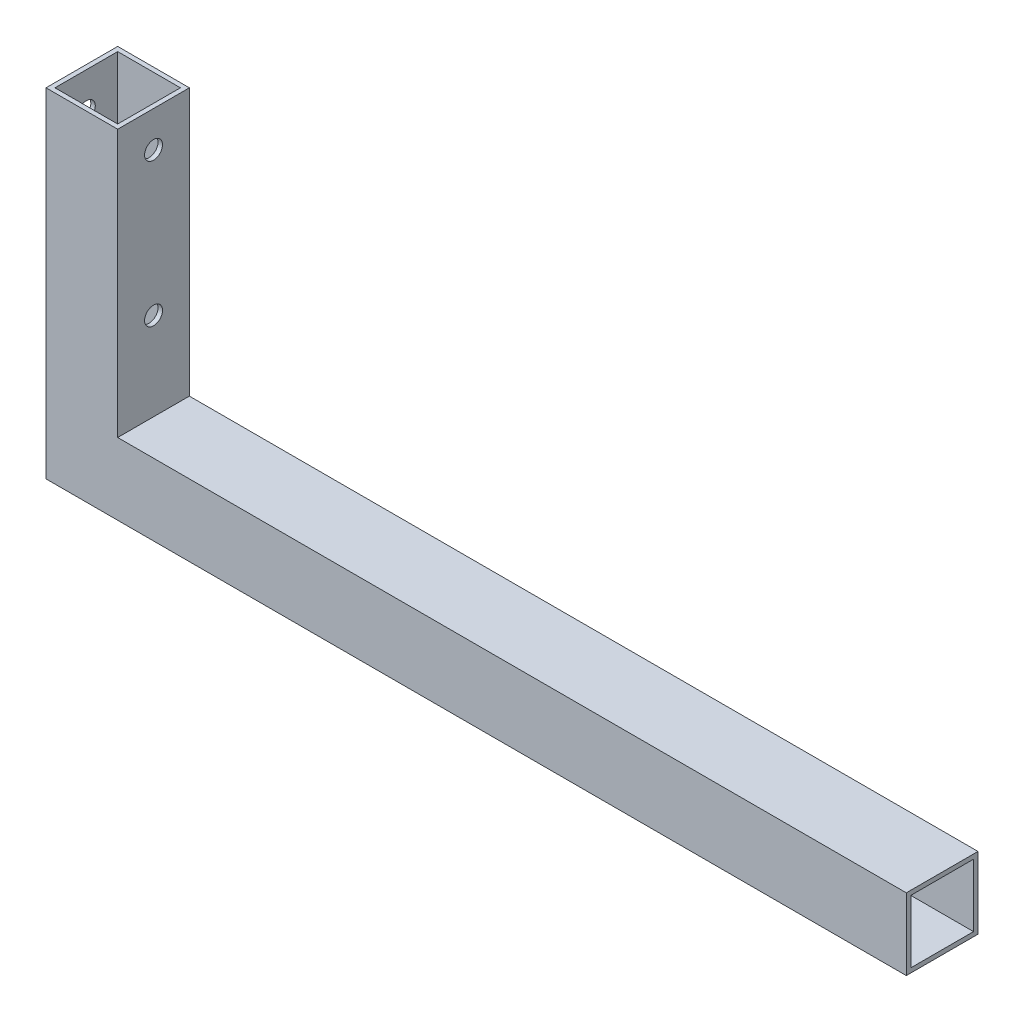
ISO-10303-21;
HEADER;
FILE_DESCRIPTION(('STEP AP214'),'2;1');
FILE_NAME('part.step','',(''),(''),'','','');
FILE_SCHEMA(('AUTOMOTIVE_DESIGN { 1 0 10303 214 1 1 1 1 }'));
ENDSEC;
DATA;
#1=APPLICATION_CONTEXT('core data for automotive mechanical design processes');
#2=APPLICATION_PROTOCOL_DEFINITION('international standard','automotive_design',2000,#1);
#3=PRODUCT_CONTEXT('',#1,'mechanical');
#4=PRODUCT('Part','Part','',(#3));
#5=PRODUCT_RELATED_PRODUCT_CATEGORY('part','',(#4));
#6=PRODUCT_DEFINITION_FORMATION('','',#4);
#7=PRODUCT_DEFINITION_CONTEXT('part definition',#1,'design');
#8=PRODUCT_DEFINITION('design','',#6,#7);
#9=PRODUCT_DEFINITION_SHAPE('','',#8);
#10=(LENGTH_UNIT() NAMED_UNIT(*) SI_UNIT(.MILLI.,.METRE.));
#11=(NAMED_UNIT(*) PLANE_ANGLE_UNIT() SI_UNIT($,.RADIAN.));
#12=(NAMED_UNIT(*) SI_UNIT($,.STERADIAN.) SOLID_ANGLE_UNIT());
#13=UNCERTAINTY_MEASURE_WITH_UNIT(LENGTH_MEASURE(1.E-05),#10,'distance_accuracy_value','');
#14=(GEOMETRIC_REPRESENTATION_CONTEXT(3) GLOBAL_UNCERTAINTY_ASSIGNED_CONTEXT((#13)) GLOBAL_UNIT_ASSIGNED_CONTEXT((#10,
#11,#12)) REPRESENTATION_CONTEXT('',''));
#15=CARTESIAN_POINT('',(0.,0.,0.));
#16=DIRECTION('',(0.,0.,1.));
#17=DIRECTION('',(1.,0.,0.));
#18=AXIS2_PLACEMENT_3D('',#15,#16,#17);
#19=CARTESIAN_POINT('',(0.,228.6,0.));
#20=DIRECTION('',(0.,1.,0.));
#21=DIRECTION('',(0.,0.,1.));
#22=AXIS2_PLACEMENT_3D('',#19,#20,#21);
#23=PLANE('',#22);
#24=DIRECTION('',(0.,0.,-1.));
#25=VECTOR('',#24,1.);
#26=CARTESIAN_POINT('',(12.7,228.6,-12.7));
#27=LINE('',#26,#25);
#28=CARTESIAN_POINT('',(12.7,228.6,12.7));
#29=VERTEX_POINT('',#28);
#30=CARTESIAN_POINT('',(12.7,228.6,-12.7));
#31=VERTEX_POINT('',#30);
#32=EDGE_CURVE('E218',#29,#31,#27,.T.);
#33=ORIENTED_EDGE('',*,*,#32,.T.);
#34=DIRECTION('',(-1.,0.,0.));
#35=VECTOR('',#34,1.);
#36=CARTESIAN_POINT('',(-12.7,228.6,-12.7));
#37=LINE('',#36,#35);
#38=CARTESIAN_POINT('',(-12.7,228.6,-12.7));
#39=VERTEX_POINT('',#38);
#40=EDGE_CURVE('E221',#31,#39,#37,.T.);
#41=ORIENTED_EDGE('',*,*,#40,.T.);
#42=DIRECTION('',(0.,0.,1.));
#43=VECTOR('',#42,1.);
#44=CARTESIAN_POINT('',(-12.7,228.6,-12.7));
#45=LINE('',#44,#43);
#46=CARTESIAN_POINT('',(-12.7,228.6,12.7));
#47=VERTEX_POINT('',#46);
#48=EDGE_CURVE('E223',#39,#47,#45,.T.);
#49=ORIENTED_EDGE('',*,*,#48,.T.);
#50=DIRECTION('',(1.,0.,0.));
#51=VECTOR('',#50,1.);
#52=CARTESIAN_POINT('',(-12.7,228.6,12.7));
#53=LINE('',#52,#51);
#54=EDGE_CURVE('E225',#47,#29,#53,.T.);
#55=ORIENTED_EDGE('',*,*,#54,.T.);
#56=EDGE_LOOP('',(#33,#41,#49,#55));
#57=FACE_BOUND('',#56,.T.);
#58=DIRECTION('',(1.,0.,0.));
#59=VECTOR('',#58,1.);
#60=CARTESIAN_POINT('',(11.1125,228.6,11.1125));
#61=LINE('',#60,#59);
#62=CARTESIAN_POINT('',(-11.1125,228.6,11.1125));
#63=VERTEX_POINT('',#62);
#64=CARTESIAN_POINT('',(11.1125,228.6,11.1125));
#65=VERTEX_POINT('',#64);
#66=EDGE_CURVE('E204',#63,#65,#61,.T.);
#67=ORIENTED_EDGE('',*,*,#66,.F.);
#68=DIRECTION('',(0.,0.,1.));
#69=VECTOR('',#68,1.);
#70=CARTESIAN_POINT('',(-11.1125,228.6,11.1125));
#71=LINE('',#70,#69);
#72=CARTESIAN_POINT('',(-11.1125,228.6,-11.1125));
#73=VERTEX_POINT('',#72);
#74=EDGE_CURVE('E202',#73,#63,#71,.T.);
#75=ORIENTED_EDGE('',*,*,#74,.F.);
#76=DIRECTION('',(-1.,0.,0.));
#77=VECTOR('',#76,1.);
#78=CARTESIAN_POINT('',(11.1125,228.6,-11.1125));
#79=LINE('',#78,#77);
#80=CARTESIAN_POINT('',(11.1125,228.6,-11.1125));
#81=VERTEX_POINT('',#80);
#82=EDGE_CURVE('E208',#81,#73,#79,.T.);
#83=ORIENTED_EDGE('',*,*,#82,.F.);
#84=DIRECTION('',(0.,0.,-1.));
#85=VECTOR('',#84,1.);
#86=CARTESIAN_POINT('',(11.1125,228.6,11.1125));
#87=LINE('',#86,#85);
#88=EDGE_CURVE('E206',#65,#81,#87,.T.);
#89=ORIENTED_EDGE('',*,*,#88,.F.);
#90=EDGE_LOOP('',(#67,#75,#83,#89));
#91=FACE_BOUND('',#90,.T.);
#92=ADVANCED_FACE('F34',(#57,#91),#23,.T.);
#93=CARTESIAN_POINT('',(12.7,228.6,-12.7));
#94=DIRECTION('',(-1.,0.,0.));
#95=DIRECTION('',(0.,0.,1.));
#96=AXIS2_PLACEMENT_3D('',#93,#94,#95);
#97=PLANE('',#96);
#98=CARTESIAN_POINT('',(12.7,165.1,0.));
#99=DIRECTION('',(1.,0.,0.));
#100=DIRECTION('',(0.,0.,-1.));
#101=AXIS2_PLACEMENT_3D('',#98,#99,#100);
#102=CIRCLE('',#101,3.175);
#103=CARTESIAN_POINT('',(12.7,165.1,-3.175));
#104=VERTEX_POINT('',#103);
#105=EDGE_CURVE('E183',#104,#104,#102,.T.);
#106=ORIENTED_EDGE('',*,*,#105,.F.);
#107=EDGE_LOOP('',(#106));
#108=FACE_BOUND('',#107,.T.);
#109=CARTESIAN_POINT('',(12.7,215.9,0.));
#110=DIRECTION('',(1.,0.,0.));
#111=DIRECTION('',(0.,0.,-1.));
#112=AXIS2_PLACEMENT_3D('',#109,#110,#111);
#113=CIRCLE('',#112,3.175);
#114=CARTESIAN_POINT('',(12.7,215.9,-3.17499999999999));
#115=VERTEX_POINT('',#114);
#116=EDGE_CURVE('E192',#115,#115,#113,.T.);
#117=ORIENTED_EDGE('',*,*,#116,.F.);
#118=EDGE_LOOP('',(#117));
#119=FACE_BOUND('',#118,.T.);
#120=DIRECTION('',(0.,-1.,0.));
#121=VECTOR('',#120,1.);
#122=CARTESIAN_POINT('',(12.7,228.6,12.7));
#123=LINE('',#122,#121);
#124=CARTESIAN_POINT('',(12.7,134.,12.7));
#125=VERTEX_POINT('',#124);
#126=EDGE_CURVE('E227',#29,#125,#123,.T.);
#127=ORIENTED_EDGE('',*,*,#126,.T.);
#128=DIRECTION('',(0.,0.,1.));
#129=VECTOR('',#128,1.);
#130=CARTESIAN_POINT('',(12.7,134.,-12.7));
#131=LINE('',#130,#129);
#132=CARTESIAN_POINT('',(12.7,134.,-12.7));
#133=VERTEX_POINT('',#132);
#134=EDGE_CURVE('E174',#133,#125,#131,.T.);
#135=ORIENTED_EDGE('',*,*,#134,.F.);
#136=DIRECTION('',(0.,-1.,0.));
#137=VECTOR('',#136,1.);
#138=CARTESIAN_POINT('',(12.7,228.6,-12.7));
#139=LINE('',#138,#137);
#140=EDGE_CURVE('E11',#31,#133,#139,.T.);
#141=ORIENTED_EDGE('',*,*,#140,.F.);
#142=ORIENTED_EDGE('',*,*,#32,.F.);
#143=EDGE_LOOP('',(#127,#135,#141,#142));
#144=FACE_BOUND('',#143,.T.);
#145=ADVANCED_FACE('F36',(#108,#119,#144),#97,.F.);
#146=CARTESIAN_POINT('',(-12.7,228.6,-12.7));
#147=DIRECTION('',(0.,0.,1.));
#148=DIRECTION('',(1.,0.,0.));
#149=AXIS2_PLACEMENT_3D('',#146,#147,#148);
#150=PLANE('',#149);
#151=ORIENTED_EDGE('',*,*,#140,.T.);
#152=DIRECTION('',(-1.,0.,0.));
#153=VECTOR('',#152,1.);
#154=CARTESIAN_POINT('',(292.1,134.,-12.7));
#155=LINE('',#154,#153);
#156=CARTESIAN_POINT('',(292.1,134.,-12.7));
#157=VERTEX_POINT('',#156);
#158=EDGE_CURVE('E161',#157,#133,#155,.T.);
#159=ORIENTED_EDGE('',*,*,#158,.F.);
#160=DIRECTION('',(0.,1.,0.));
#161=VECTOR('',#160,1.);
#162=CARTESIAN_POINT('',(292.1,108.6,-12.7));
#163=LINE('',#162,#161);
#164=CARTESIAN_POINT('',(292.1,108.6,-12.7));
#165=VERTEX_POINT('',#164);
#166=EDGE_CURVE('E159',#165,#157,#163,.T.);
#167=ORIENTED_EDGE('',*,*,#166,.F.);
#168=DIRECTION('',(1.,0.,0.));
#169=VECTOR('',#168,1.);
#170=CARTESIAN_POINT('',(-500000.,108.6,-12.7));
#171=LINE('',#170,#169);
#172=CARTESIAN_POINT('',(-12.7,108.6,-12.7));
#173=VERTEX_POINT('',#172);
#174=EDGE_CURVE('E169',#173,#165,#171,.T.);
#175=ORIENTED_EDGE('',*,*,#174,.F.);
#176=DIRECTION('',(0.,-1.,0.));
#177=VECTOR('',#176,1.);
#178=CARTESIAN_POINT('',(-12.7,228.6,-12.7));
#179=LINE('',#178,#177);
#180=EDGE_CURVE('E43',#39,#173,#179,.T.);
#181=ORIENTED_EDGE('',*,*,#180,.F.);
#182=ORIENTED_EDGE('',*,*,#40,.F.);
#183=EDGE_LOOP('',(#151,#159,#167,#175,#181,#182));
#184=FACE_BOUND('',#183,.T.);
#185=ADVANCED_FACE('F257',(#184),#150,.F.);
#186=CARTESIAN_POINT('',(-12.7,228.6,-12.7));
#187=DIRECTION('',(1.,0.,0.));
#188=DIRECTION('',(0.,0.,-1.));
#189=AXIS2_PLACEMENT_3D('',#186,#187,#188);
#190=PLANE('',#189);
#191=CARTESIAN_POINT('',(-12.7,165.1,0.));
#192=DIRECTION('',(1.,0.,0.));
#193=DIRECTION('',(0.,0.,-1.));
#194=AXIS2_PLACEMENT_3D('',#191,#192,#193);
#195=CIRCLE('',#194,3.175);
#196=CARTESIAN_POINT('',(-12.7,165.1,-3.175));
#197=VERTEX_POINT('',#196);
#198=EDGE_CURVE('E184',#197,#197,#195,.T.);
#199=ORIENTED_EDGE('',*,*,#198,.T.);
#200=EDGE_LOOP('',(#199));
#201=FACE_BOUND('',#200,.T.);
#202=CARTESIAN_POINT('',(-12.7,215.9,0.));
#203=DIRECTION('',(1.,0.,0.));
#204=DIRECTION('',(0.,0.,-1.));
#205=AXIS2_PLACEMENT_3D('',#202,#203,#204);
#206=CIRCLE('',#205,3.175);
#207=CARTESIAN_POINT('',(-12.7,215.9,-3.17499999999999));
#208=VERTEX_POINT('',#207);
#209=EDGE_CURVE('E193',#208,#208,#206,.T.);
#210=ORIENTED_EDGE('',*,*,#209,.T.);
#211=EDGE_LOOP('',(#210));
#212=FACE_BOUND('',#211,.T.);
#213=ORIENTED_EDGE('',*,*,#180,.T.);
#214=DIRECTION('',(0.,0.,1.));
#215=VECTOR('',#214,1.);
#216=CARTESIAN_POINT('',(-12.7,108.6,-12.7));
#217=LINE('',#216,#215);
#218=CARTESIAN_POINT('',(-12.7,108.6,12.7));
#219=VERTEX_POINT('',#218);
#220=EDGE_CURVE('E175',#173,#219,#217,.T.);
#221=ORIENTED_EDGE('',*,*,#220,.T.);
#222=DIRECTION('',(0.,-1.,0.));
#223=VECTOR('',#222,1.);
#224=CARTESIAN_POINT('',(-12.7,228.6,12.7));
#225=LINE('',#224,#223);
#226=EDGE_CURVE('E229',#47,#219,#225,.T.);
#227=ORIENTED_EDGE('',*,*,#226,.F.);
#228=ORIENTED_EDGE('',*,*,#48,.F.);
#229=EDGE_LOOP('',(#213,#221,#227,#228));
#230=FACE_BOUND('',#229,.T.);
#231=ADVANCED_FACE('F265',(#201,#212,#230),#190,.F.);
#232=CARTESIAN_POINT('',(-12.7,228.6,12.7));
#233=DIRECTION('',(0.,0.,-1.));
#234=DIRECTION('',(-1.,0.,0.));
#235=AXIS2_PLACEMENT_3D('',#232,#233,#234);
#236=PLANE('',#235);
#237=ORIENTED_EDGE('',*,*,#226,.T.);
#238=DIRECTION('',(1.,0.,0.));
#239=VECTOR('',#238,1.);
#240=CARTESIAN_POINT('',(-500000.,108.6,12.7));
#241=LINE('',#240,#239);
#242=CARTESIAN_POINT('',(292.1,108.6,12.7));
#243=VERTEX_POINT('',#242);
#244=EDGE_CURVE('E172',#219,#243,#241,.T.);
#245=ORIENTED_EDGE('',*,*,#244,.T.);
#246=DIRECTION('',(0.,-1.,0.));
#247=VECTOR('',#246,1.);
#248=CARTESIAN_POINT('',(292.1,134.,12.7));
#249=LINE('',#248,#247);
#250=CARTESIAN_POINT('',(292.1,134.,12.7));
#251=VERTEX_POINT('',#250);
#252=EDGE_CURVE('E153',#251,#243,#249,.T.);
#253=ORIENTED_EDGE('',*,*,#252,.F.);
#254=DIRECTION('',(-1.,0.,0.));
#255=VECTOR('',#254,1.);
#256=CARTESIAN_POINT('',(292.1,134.,12.7));
#257=LINE('',#256,#255);
#258=EDGE_CURVE('E131',#251,#125,#257,.T.);
#259=ORIENTED_EDGE('',*,*,#258,.T.);
#260=ORIENTED_EDGE('',*,*,#126,.F.);
#261=ORIENTED_EDGE('',*,*,#54,.F.);
#262=EDGE_LOOP('',(#237,#245,#253,#259,#260,#261));
#263=FACE_BOUND('',#262,.T.);
#264=ADVANCED_FACE('F262',(#263),#236,.F.);
#265=CARTESIAN_POINT('',(-11.1125,228.6,11.1125));
#266=DIRECTION('',(1.,0.,0.));
#267=DIRECTION('',(0.,0.,-1.));
#268=AXIS2_PLACEMENT_3D('',#265,#266,#267);
#269=PLANE('',#268);
#270=DIRECTION('',(0.,0.,1.));
#271=VECTOR('',#270,1.);
#272=CARTESIAN_POINT('',(-11.1125,110.1875,11.1125));
#273=LINE('',#272,#271);
#274=CARTESIAN_POINT('',(-11.1124999999674,110.1875,-11.1125));
#275=VERTEX_POINT('',#274);
#276=CARTESIAN_POINT('',(-11.1125,110.1875,11.1125));
#277=VERTEX_POINT('',#276);
#278=EDGE_CURVE('E180',#275,#277,#273,.T.);
#279=ORIENTED_EDGE('',*,*,#278,.F.);
#280=DIRECTION('',(0.,-1.,0.));
#281=VECTOR('',#280,1.);
#282=CARTESIAN_POINT('',(-11.1125,228.6,-11.1125));
#283=LINE('',#282,#281);
#284=EDGE_CURVE('E210',#73,#275,#283,.T.);
#285=ORIENTED_EDGE('',*,*,#284,.F.);
#286=ORIENTED_EDGE('',*,*,#74,.T.);
#287=DIRECTION('',(0.,-1.,0.));
#288=VECTOR('',#287,1.);
#289=CARTESIAN_POINT('',(-11.1125,228.6,11.1125));
#290=LINE('',#289,#288);
#291=EDGE_CURVE('E216',#63,#277,#290,.T.);
#292=ORIENTED_EDGE('',*,*,#291,.T.);
#293=EDGE_LOOP('',(#279,#285,#286,#292));
#294=FACE_BOUND('',#293,.T.);
#295=CARTESIAN_POINT('',(-11.1125,165.1,0.));
#296=DIRECTION('',(1.,0.,0.));
#297=DIRECTION('',(0.,0.,-1.));
#298=AXIS2_PLACEMENT_3D('',#295,#296,#297);
#299=CIRCLE('',#298,3.175);
#300=CARTESIAN_POINT('',(-11.1125,165.1,-3.175));
#301=VERTEX_POINT('',#300);
#302=EDGE_CURVE('E189',#301,#301,#299,.T.);
#303=ORIENTED_EDGE('',*,*,#302,.F.);
#304=EDGE_LOOP('',(#303));
#305=FACE_BOUND('',#304,.T.);
#306=CARTESIAN_POINT('',(-11.1125,215.9,0.));
#307=DIRECTION('',(1.,0.,0.));
#308=DIRECTION('',(0.,0.,-1.));
#309=AXIS2_PLACEMENT_3D('',#306,#307,#308);
#310=CIRCLE('',#309,3.175);
#311=CARTESIAN_POINT('',(-11.1125,215.9,-3.17499999999999));
#312=VERTEX_POINT('',#311);
#313=EDGE_CURVE('E199',#312,#312,#310,.T.);
#314=ORIENTED_EDGE('',*,*,#313,.F.);
#315=EDGE_LOOP('',(#314));
#316=FACE_BOUND('',#315,.T.);
#317=ADVANCED_FACE('F247',(#294,#305,#316),#269,.T.);
#318=CARTESIAN_POINT('',(11.1125,228.6,11.1125));
#319=DIRECTION('',(0.,0.,-1.));
#320=DIRECTION('',(-1.,0.,0.));
#321=AXIS2_PLACEMENT_3D('',#318,#319,#320);
#322=PLANE('',#321);
#323=DIRECTION('',(0.,-1.,0.));
#324=VECTOR('',#323,1.);
#325=CARTESIAN_POINT('',(11.1125,228.6,11.1125));
#326=LINE('',#325,#324);
#327=CARTESIAN_POINT('',(11.1125,132.4125,11.1125));
#328=VERTEX_POINT('',#327);
#329=EDGE_CURVE('E213',#65,#328,#326,.T.);
#330=ORIENTED_EDGE('',*,*,#329,.T.);
#331=DIRECTION('',(1.,0.,0.));
#332=VECTOR('',#331,1.);
#333=CARTESIAN_POINT('',(-500000.,132.4125,11.1125));
#334=LINE('',#333,#332);
#335=CARTESIAN_POINT('',(292.1,132.4125,11.1125));
#336=VERTEX_POINT('',#335);
#337=EDGE_CURVE('E130',#328,#336,#334,.T.);
#338=ORIENTED_EDGE('',*,*,#337,.T.);
#339=DIRECTION('',(0.,-1.,0.));
#340=VECTOR('',#339,1.);
#341=CARTESIAN_POINT('',(292.1,132.4125,11.1125));
#342=LINE('',#341,#340);
#343=CARTESIAN_POINT('',(292.1,110.1875,11.1125));
#344=VERTEX_POINT('',#343);
#345=EDGE_CURVE('E144',#336,#344,#342,.T.);
#346=ORIENTED_EDGE('',*,*,#345,.T.);
#347=DIRECTION('',(1.,0.,0.));
#348=VECTOR('',#347,1.);
#349=CARTESIAN_POINT('',(-500000.,110.1875,11.1125));
#350=LINE('',#349,#348);
#351=EDGE_CURVE('E167',#277,#344,#350,.T.);
#352=ORIENTED_EDGE('',*,*,#351,.F.);
#353=ORIENTED_EDGE('',*,*,#291,.F.);
#354=ORIENTED_EDGE('',*,*,#66,.T.);
#355=EDGE_LOOP('',(#330,#338,#346,#352,#353,#354));
#356=FACE_BOUND('',#355,.T.);
#357=ADVANCED_FACE('F240',(#356),#322,.T.);
#358=CARTESIAN_POINT('',(11.1125,228.6,11.1125));
#359=DIRECTION('',(-1.,0.,0.));
#360=DIRECTION('',(0.,0.,1.));
#361=AXIS2_PLACEMENT_3D('',#358,#359,#360);
#362=PLANE('',#361);
#363=DIRECTION('',(0.,0.,-1.));
#364=VECTOR('',#363,1.);
#365=CARTESIAN_POINT('',(11.1125,132.4125,11.1125));
#366=LINE('',#365,#364);
#367=CARTESIAN_POINT('',(11.1125,132.4125,-11.1125));
#368=VERTEX_POINT('',#367);
#369=EDGE_CURVE('E129',#328,#368,#366,.T.);
#370=ORIENTED_EDGE('',*,*,#369,.F.);
#371=ORIENTED_EDGE('',*,*,#329,.F.);
#372=ORIENTED_EDGE('',*,*,#88,.T.);
#373=DIRECTION('',(0.,-1.,0.));
#374=VECTOR('',#373,1.);
#375=CARTESIAN_POINT('',(11.1125,228.6,-11.1125));
#376=LINE('',#375,#374);
#377=EDGE_CURVE('E51',#81,#368,#376,.T.);
#378=ORIENTED_EDGE('',*,*,#377,.T.);
#379=EDGE_LOOP('',(#370,#371,#372,#378));
#380=FACE_BOUND('',#379,.T.);
#381=CARTESIAN_POINT('',(11.1125,165.1,0.));
#382=DIRECTION('',(-1.,0.,0.));
#383=DIRECTION('',(0.,0.,1.));
#384=AXIS2_PLACEMENT_3D('',#381,#382,#383);
#385=CIRCLE('',#384,3.175);
#386=CARTESIAN_POINT('',(11.1125,165.1,3.17499999999999));
#387=VERTEX_POINT('',#386);
#388=EDGE_CURVE('E38',#387,#387,#385,.T.);
#389=ORIENTED_EDGE('',*,*,#388,.F.);
#390=EDGE_LOOP('',(#389));
#391=FACE_BOUND('',#390,.T.);
#392=CARTESIAN_POINT('',(11.1125,215.9,0.));
#393=DIRECTION('',(-1.,0.,0.));
#394=DIRECTION('',(0.,0.,1.));
#395=AXIS2_PLACEMENT_3D('',#392,#393,#394);
#396=CIRCLE('',#395,3.175);
#397=CARTESIAN_POINT('',(11.1125,215.9,3.175));
#398=VERTEX_POINT('',#397);
#399=EDGE_CURVE('E196',#398,#398,#396,.T.);
#400=ORIENTED_EDGE('',*,*,#399,.F.);
#401=EDGE_LOOP('',(#400));
#402=FACE_BOUND('',#401,.T.);
#403=ADVANCED_FACE('F238',(#380,#391,#402),#362,.T.);
#404=CARTESIAN_POINT('',(11.1125,228.6,-11.1125));
#405=DIRECTION('',(0.,0.,1.));
#406=DIRECTION('',(1.,0.,0.));
#407=AXIS2_PLACEMENT_3D('',#404,#405,#406);
#408=PLANE('',#407);
#409=ORIENTED_EDGE('',*,*,#284,.T.);
#410=DIRECTION('',(1.,0.,0.));
#411=VECTOR('',#410,1.);
#412=CARTESIAN_POINT('',(-500000.,110.1875,-11.1125));
#413=LINE('',#412,#411);
#414=CARTESIAN_POINT('',(292.1,110.1875,-11.1125));
#415=VERTEX_POINT('',#414);
#416=EDGE_CURVE('E137',#275,#415,#413,.T.);
#417=ORIENTED_EDGE('',*,*,#416,.T.);
#418=DIRECTION('',(0.,1.,0.));
#419=VECTOR('',#418,1.);
#420=CARTESIAN_POINT('',(292.1,110.1875,-11.1125));
#421=LINE('',#420,#419);
#422=CARTESIAN_POINT('',(292.1,132.4125,-11.1125));
#423=VERTEX_POINT('',#422);
#424=EDGE_CURVE('E134',#415,#423,#421,.T.);
#425=ORIENTED_EDGE('',*,*,#424,.T.);
#426=DIRECTION('',(1.,0.,0.));
#427=VECTOR('',#426,1.);
#428=CARTESIAN_POINT('',(-500000.,132.4125,-11.1125));
#429=LINE('',#428,#427);
#430=EDGE_CURVE('E122',#368,#423,#429,.T.);
#431=ORIENTED_EDGE('',*,*,#430,.F.);
#432=ORIENTED_EDGE('',*,*,#377,.F.);
#433=ORIENTED_EDGE('',*,*,#82,.T.);
#434=EDGE_LOOP('',(#409,#417,#425,#431,#432,#433));
#435=FACE_BOUND('',#434,.T.);
#436=ADVANCED_FACE('F135',(#435),#408,.T.);
#437=CARTESIAN_POINT('',(-12.7,215.9,0.));
#438=DIRECTION('',(1.,0.,0.));
#439=DIRECTION('',(0.,0.,-1.));
#440=AXIS2_PLACEMENT_3D('',#437,#438,#439);
#441=CYLINDRICAL_SURFACE('',#440,3.175);
#442=ORIENTED_EDGE('',*,*,#399,.T.);
#443=EDGE_LOOP('',(#442));
#444=FACE_BOUND('',#443,.T.);
#445=ORIENTED_EDGE('',*,*,#116,.T.);
#446=EDGE_LOOP('',(#445));
#447=FACE_BOUND('',#446,.T.);
#448=ADVANCED_FACE('F235',(#444,#447),#441,.F.);
#449=ORIENTED_EDGE('',*,*,#313,.T.);
#450=EDGE_LOOP('',(#449));
#451=FACE_BOUND('',#450,.T.);
#452=ORIENTED_EDGE('',*,*,#209,.F.);
#453=EDGE_LOOP('',(#452));
#454=FACE_BOUND('',#453,.T.);
#455=ADVANCED_FACE('F334',(#451,#454),#441,.F.);
#456=CARTESIAN_POINT('',(-12.7,165.1,0.));
#457=DIRECTION('',(1.,0.,0.));
#458=DIRECTION('',(0.,0.,-1.));
#459=AXIS2_PLACEMENT_3D('',#456,#457,#458);
#460=CYLINDRICAL_SURFACE('',#459,3.175);
#461=ORIENTED_EDGE('',*,*,#388,.T.);
#462=EDGE_LOOP('',(#461));
#463=FACE_BOUND('',#462,.T.);
#464=ORIENTED_EDGE('',*,*,#105,.T.);
#465=EDGE_LOOP('',(#464));
#466=FACE_BOUND('',#465,.T.);
#467=ADVANCED_FACE('F304',(#463,#466),#460,.F.);
#468=ORIENTED_EDGE('',*,*,#302,.T.);
#469=EDGE_LOOP('',(#468));
#470=FACE_BOUND('',#469,.T.);
#471=ORIENTED_EDGE('',*,*,#198,.F.);
#472=EDGE_LOOP('',(#471));
#473=FACE_BOUND('',#472,.T.);
#474=ADVANCED_FACE('F296',(#470,#473),#460,.F.);
#475=CARTESIAN_POINT('',(-500000.,108.6,12.7));
#476=DIRECTION('',(0.,-1.,0.));
#477=DIRECTION('',(0.,0.,-1.));
#478=AXIS2_PLACEMENT_3D('',#475,#476,#477);
#479=PLANE('',#478);
#480=ORIENTED_EDGE('',*,*,#244,.F.);
#481=ORIENTED_EDGE('',*,*,#220,.F.);
#482=ORIENTED_EDGE('',*,*,#174,.T.);
#483=DIRECTION('',(0.,0.,-1.));
#484=VECTOR('',#483,1.);
#485=CARTESIAN_POINT('',(292.1,108.6,12.7));
#486=LINE('',#485,#484);
#487=EDGE_CURVE('E156',#243,#165,#486,.T.);
#488=ORIENTED_EDGE('',*,*,#487,.F.);
#489=EDGE_LOOP('',(#480,#481,#482,#488));
#490=FACE_BOUND('',#489,.T.);
#491=ADVANCED_FACE('F290',(#490),#479,.T.);
#492=CARTESIAN_POINT('',(-500000.,132.4125,-11.1125));
#493=DIRECTION('',(0.,1.,0.));
#494=DIRECTION('',(0.,0.,1.));
#495=AXIS2_PLACEMENT_3D('',#492,#493,#494);
#496=PLANE('',#495);
#497=ORIENTED_EDGE('',*,*,#369,.T.);
#498=ORIENTED_EDGE('',*,*,#430,.T.);
#499=DIRECTION('',(0.,0.,1.));
#500=VECTOR('',#499,1.);
#501=CARTESIAN_POINT('',(292.1,132.4125,-11.1125));
#502=LINE('',#501,#500);
#503=EDGE_CURVE('E127',#423,#336,#502,.T.);
#504=ORIENTED_EDGE('',*,*,#503,.T.);
#505=ORIENTED_EDGE('',*,*,#337,.F.);
#506=EDGE_LOOP('',(#497,#498,#504,#505));
#507=FACE_BOUND('',#506,.T.);
#508=ADVANCED_FACE('F124',(#507),#496,.F.);
#509=CARTESIAN_POINT('',(-500000.,110.1875,11.1125));
#510=DIRECTION('',(0.,-1.,0.));
#511=DIRECTION('',(0.,0.,-1.));
#512=AXIS2_PLACEMENT_3D('',#509,#510,#511);
#513=PLANE('',#512);
#514=ORIENTED_EDGE('',*,*,#278,.T.);
#515=ORIENTED_EDGE('',*,*,#351,.T.);
#516=DIRECTION('',(0.,0.,-1.));
#517=VECTOR('',#516,1.);
#518=CARTESIAN_POINT('',(292.1,110.1875,11.1125));
#519=LINE('',#518,#517);
#520=EDGE_CURVE('E146',#344,#415,#519,.T.);
#521=ORIENTED_EDGE('',*,*,#520,.T.);
#522=ORIENTED_EDGE('',*,*,#416,.F.);
#523=EDGE_LOOP('',(#514,#515,#521,#522));
#524=FACE_BOUND('',#523,.T.);
#525=ADVANCED_FACE('F302',(#524),#513,.F.);
#526=CARTESIAN_POINT('',(292.1,0.,0.));
#527=DIRECTION('',(1.,0.,0.));
#528=DIRECTION('',(0.,0.,-1.));
#529=AXIS2_PLACEMENT_3D('',#526,#527,#528);
#530=PLANE('',#529);
#531=DIRECTION('',(0.,0.,1.));
#532=VECTOR('',#531,1.);
#533=CARTESIAN_POINT('',(292.1,134.,-12.7));
#534=LINE('',#533,#532);
#535=EDGE_CURVE('E150',#157,#251,#534,.T.);
#536=ORIENTED_EDGE('',*,*,#535,.T.);
#537=ORIENTED_EDGE('',*,*,#252,.T.);
#538=ORIENTED_EDGE('',*,*,#487,.T.);
#539=ORIENTED_EDGE('',*,*,#166,.T.);
#540=EDGE_LOOP('',(#536,#537,#538,#539));
#541=FACE_BOUND('',#540,.T.);
#542=ORIENTED_EDGE('',*,*,#503,.F.);
#543=ORIENTED_EDGE('',*,*,#424,.F.);
#544=ORIENTED_EDGE('',*,*,#520,.F.);
#545=ORIENTED_EDGE('',*,*,#345,.F.);
#546=EDGE_LOOP('',(#542,#543,#544,#545));
#547=FACE_BOUND('',#546,.T.);
#548=ADVANCED_FACE('F142',(#541,#547),#530,.T.);
#549=CARTESIAN_POINT('',(292.1,134.,-12.7));
#550=DIRECTION('',(0.,-1.,0.));
#551=DIRECTION('',(0.,0.,-1.));
#552=AXIS2_PLACEMENT_3D('',#549,#550,#551);
#553=PLANE('',#552);
#554=ORIENTED_EDGE('',*,*,#134,.T.);
#555=ORIENTED_EDGE('',*,*,#258,.F.);
#556=ORIENTED_EDGE('',*,*,#535,.F.);
#557=ORIENTED_EDGE('',*,*,#158,.T.);
#558=EDGE_LOOP('',(#554,#555,#556,#557));
#559=FACE_BOUND('',#558,.T.);
#560=ADVANCED_FACE('F281',(#559),#553,.F.);
#561=CLOSED_SHELL('',(#92,#145,#185,#231,#264,#317,#357,#403,#436,#448,#455,#467,#474,#491,#508,
#525,#548,#560));
#562=MANIFOLD_SOLID_BREP('B2',#561);
#563=ADVANCED_BREP_SHAPE_REPRESENTATION('',(#18,#562),#14);
#564=SHAPE_DEFINITION_REPRESENTATION(#9,#563);
ENDSEC;
END-ISO-10303-21;
